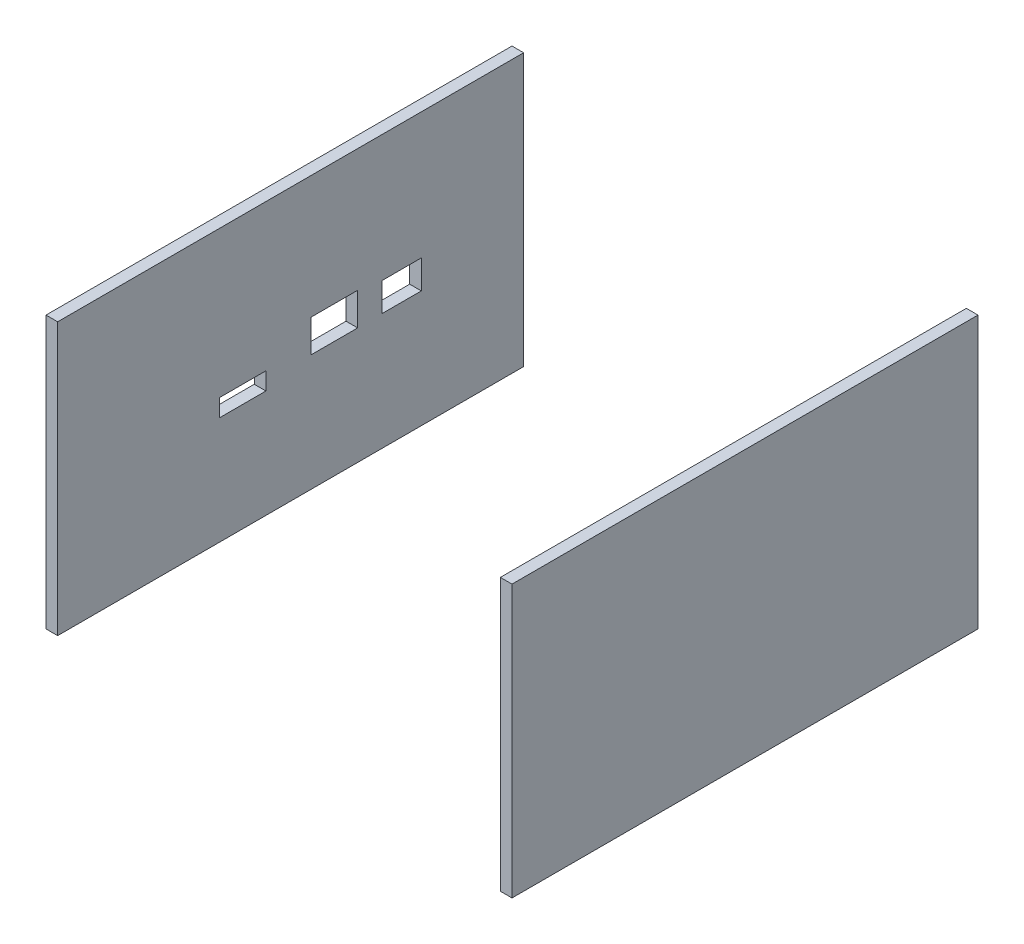
ISO-10303-21;
HEADER;
FILE_DESCRIPTION(('STEP AP214'),'2;1');
FILE_NAME('part.step','',(''),(''),'','','');
FILE_SCHEMA(('AUTOMOTIVE_DESIGN { 1 0 10303 214 1 1 1 1 }'));
ENDSEC;
DATA;
#1=APPLICATION_CONTEXT('core data for automotive mechanical design processes');
#2=APPLICATION_PROTOCOL_DEFINITION('international standard','automotive_design',2000,#1);
#3=PRODUCT_CONTEXT('',#1,'mechanical');
#4=PRODUCT('Part','Part','',(#3));
#5=PRODUCT_RELATED_PRODUCT_CATEGORY('part','',(#4));
#6=PRODUCT_DEFINITION_FORMATION('','',#4);
#7=PRODUCT_DEFINITION_CONTEXT('part definition',#1,'design');
#8=PRODUCT_DEFINITION('design','',#6,#7);
#9=PRODUCT_DEFINITION_SHAPE('','',#8);
#10=(LENGTH_UNIT() NAMED_UNIT(*) SI_UNIT(.MILLI.,.METRE.));
#11=(NAMED_UNIT(*) PLANE_ANGLE_UNIT() SI_UNIT($,.RADIAN.));
#12=(NAMED_UNIT(*) SI_UNIT($,.STERADIAN.) SOLID_ANGLE_UNIT());
#13=UNCERTAINTY_MEASURE_WITH_UNIT(LENGTH_MEASURE(1.E-05),#10,'distance_accuracy_value','');
#14=(GEOMETRIC_REPRESENTATION_CONTEXT(3) GLOBAL_UNCERTAINTY_ASSIGNED_CONTEXT((#13)) GLOBAL_UNIT_ASSIGNED_CONTEXT((#10,
#11,#12)) REPRESENTATION_CONTEXT('',''));
#15=CARTESIAN_POINT('',(0.,0.,0.));
#16=DIRECTION('',(0.,0.,1.));
#17=DIRECTION('',(1.,0.,0.));
#18=AXIS2_PLACEMENT_3D('',#15,#16,#17);
#19=CARTESIAN_POINT('',(60.,73.,60.));
#20=DIRECTION('',(0.,0.,-1.));
#21=DIRECTION('',(-1.,0.,0.));
#22=AXIS2_PLACEMENT_3D('',#19,#20,#21);
#23=PLANE('',#22);
#24=DIRECTION('',(1.,0.,0.));
#25=VECTOR('',#24,1.);
#26=CARTESIAN_POINT('',(60.,3.,60.));
#27=LINE('',#26,#25);
#28=CARTESIAN_POINT('',(-60.,3.,60.));
#29=VERTEX_POINT('',#28);
#30=CARTESIAN_POINT('',(-57.,3.,60.));
#31=VERTEX_POINT('',#30);
#32=EDGE_CURVE('E45',#29,#31,#27,.T.);
#33=ORIENTED_EDGE('',*,*,#32,.T.);
#34=DIRECTION('',(0.,1.,0.));
#35=VECTOR('',#34,1.);
#36=CARTESIAN_POINT('',(-57.,73.,60.));
#37=LINE('',#36,#35);
#38=CARTESIAN_POINT('',(-57.,73.,60.));
#39=VERTEX_POINT('',#38);
#40=EDGE_CURVE('E158',#31,#39,#37,.T.);
#41=ORIENTED_EDGE('',*,*,#40,.T.);
#42=DIRECTION('',(1.,0.,0.));
#43=VECTOR('',#42,1.);
#44=CARTESIAN_POINT('',(-60.,73.,60.));
#45=LINE('',#44,#43);
#46=CARTESIAN_POINT('',(-60.,73.,60.));
#47=VERTEX_POINT('',#46);
#48=EDGE_CURVE('E160',#47,#39,#45,.T.);
#49=ORIENTED_EDGE('',*,*,#48,.F.);
#50=DIRECTION('',(0.,-1.,0.));
#51=VECTOR('',#50,1.);
#52=CARTESIAN_POINT('',(-60.,73.,60.));
#53=LINE('',#52,#51);
#54=EDGE_CURVE('E173',#47,#29,#53,.T.);
#55=ORIENTED_EDGE('',*,*,#54,.T.);
#56=EDGE_LOOP('',(#33,#41,#49,#55));
#57=FACE_BOUND('',#56,.T.);
#58=ADVANCED_FACE('F42',(#57),#23,.F.);
#59=CARTESIAN_POINT('',(60.,73.,-60.));
#60=DIRECTION('',(0.,0.,1.));
#61=DIRECTION('',(1.,0.,0.));
#62=AXIS2_PLACEMENT_3D('',#59,#60,#61);
#63=PLANE('',#62);
#64=DIRECTION('',(1.,0.,0.));
#65=VECTOR('',#64,1.);
#66=CARTESIAN_POINT('',(60.,73.,-60.));
#67=LINE('',#66,#65);
#68=CARTESIAN_POINT('',(-60.,73.,-60.));
#69=VERTEX_POINT('',#68);
#70=CARTESIAN_POINT('',(-57.,73.,-60.));
#71=VERTEX_POINT('',#70);
#72=EDGE_CURVE('E167',#69,#71,#67,.T.);
#73=ORIENTED_EDGE('',*,*,#72,.T.);
#74=DIRECTION('',(0.,1.,0.));
#75=VECTOR('',#74,1.);
#76=CARTESIAN_POINT('',(-57.,3.,-60.));
#77=LINE('',#76,#75);
#78=CARTESIAN_POINT('',(-57.,3.,-60.));
#79=VERTEX_POINT('',#78);
#80=EDGE_CURVE('E12',#79,#71,#77,.T.);
#81=ORIENTED_EDGE('',*,*,#80,.F.);
#82=DIRECTION('',(-1.,0.,0.));
#83=VECTOR('',#82,1.);
#84=CARTESIAN_POINT('',(60.,3.,-60.));
#85=LINE('',#84,#83);
#86=CARTESIAN_POINT('',(-60.,3.,-60.));
#87=VERTEX_POINT('',#86);
#88=EDGE_CURVE('E161',#79,#87,#85,.T.);
#89=ORIENTED_EDGE('',*,*,#88,.T.);
#90=DIRECTION('',(0.,-1.,0.));
#91=VECTOR('',#90,1.);
#92=CARTESIAN_POINT('',(-60.,73.,-60.));
#93=LINE('',#92,#91);
#94=EDGE_CURVE('E223',#69,#87,#93,.T.);
#95=ORIENTED_EDGE('',*,*,#94,.F.);
#96=EDGE_LOOP('',(#73,#81,#89,#95));
#97=FACE_BOUND('',#96,.T.);
#98=ADVANCED_FACE('F164',(#97),#63,.F.);
#99=CARTESIAN_POINT('',(-55.452,3.,27.2274203577471));
#100=DIRECTION('',(0.,1.,0.));
#101=DIRECTION('',(0.,0.,1.));
#102=AXIS2_PLACEMENT_3D('',#99,#100,#101);
#103=PLANE('',#102);
#104=ORIENTED_EDGE('',*,*,#88,.F.);
#105=DIRECTION('',(0.,0.,1.));
#106=VECTOR('',#105,1.);
#107=CARTESIAN_POINT('',(-57.,3.,-60.));
#108=LINE('',#107,#106);
#109=EDGE_CURVE('E60',#79,#31,#108,.T.);
#110=ORIENTED_EDGE('',*,*,#109,.T.);
#111=ORIENTED_EDGE('',*,*,#32,.F.);
#112=DIRECTION('',(0.,0.,1.));
#113=VECTOR('',#112,1.);
#114=CARTESIAN_POINT('',(-60.,3.,60.));
#115=LINE('',#114,#113);
#116=EDGE_CURVE('E170',#87,#29,#115,.T.);
#117=ORIENTED_EDGE('',*,*,#116,.F.);
#118=EDGE_LOOP('',(#104,#110,#111,#117));
#119=FACE_BOUND('',#118,.T.);
#120=ADVANCED_FACE('F168',(#119),#103,.F.);
#121=CARTESIAN_POINT('',(-60.,73.,-80.));
#122=DIRECTION('',(0.,-1.,0.));
#123=DIRECTION('',(0.,0.,-1.));
#124=AXIS2_PLACEMENT_3D('',#121,#122,#123);
#125=PLANE('',#124);
#126=ORIENTED_EDGE('',*,*,#48,.T.);
#127=DIRECTION('',(0.,0.,-1.));
#128=VECTOR('',#127,1.);
#129=CARTESIAN_POINT('',(-57.,73.,-80.));
#130=LINE('',#129,#128);
#131=EDGE_CURVE('E151',#39,#71,#130,.T.);
#132=ORIENTED_EDGE('',*,*,#131,.T.);
#133=ORIENTED_EDGE('',*,*,#72,.F.);
#134=DIRECTION('',(0.,0.,1.));
#135=VECTOR('',#134,1.);
#136=CARTESIAN_POINT('',(-60.,73.,-80.));
#137=LINE('',#136,#135);
#138=EDGE_CURVE('E253',#69,#47,#137,.T.);
#139=ORIENTED_EDGE('',*,*,#138,.T.);
#140=EDGE_LOOP('',(#126,#132,#133,#139));
#141=FACE_BOUND('',#140,.T.);
#142=ADVANCED_FACE('F277',(#141),#125,.F.);
#143=CARTESIAN_POINT('',(-60.,73.,60.));
#144=DIRECTION('',(1.,0.,0.));
#145=DIRECTION('',(0.,0.,-1.));
#146=AXIS2_PLACEMENT_3D('',#143,#144,#145);
#147=PLANE('',#146);
#148=DIRECTION('',(0.,1.,0.));
#149=VECTOR('',#148,1.);
#150=CARTESIAN_POINT('',(-60.,0.,18.3674203577471));
#151=LINE('',#150,#149);
#152=CARTESIAN_POINT('',(-60.,30.75,18.3674203577471));
#153=VERTEX_POINT('',#152);
#154=CARTESIAN_POINT('',(-60.,35.25,18.3674203577471));
#155=VERTEX_POINT('',#154);
#156=EDGE_CURVE('E51',#153,#155,#151,.T.);
#157=ORIENTED_EDGE('',*,*,#156,.F.);
#158=DIRECTION('',(0.,0.,1.));
#159=VECTOR('',#158,1.);
#160=CARTESIAN_POINT('',(-60.,30.75,0.));
#161=LINE('',#160,#159);
#162=CARTESIAN_POINT('',(-60.,30.75,6.36742035774705));
#163=VERTEX_POINT('',#162);
#164=EDGE_CURVE('E247',#163,#153,#161,.T.);
#165=ORIENTED_EDGE('',*,*,#164,.F.);
#166=DIRECTION('',(0.,1.,0.));
#167=VECTOR('',#166,1.);
#168=CARTESIAN_POINT('',(-60.,0.,6.36742035774705));
#169=LINE('',#168,#167);
#170=CARTESIAN_POINT('',(-60.,35.25,6.36742035774705));
#171=VERTEX_POINT('',#170);
#172=EDGE_CURVE('E249',#163,#171,#169,.T.);
#173=ORIENTED_EDGE('',*,*,#172,.T.);
#174=DIRECTION('',(0.,0.,1.));
#175=VECTOR('',#174,1.);
#176=CARTESIAN_POINT('',(-60.,35.25,0.));
#177=LINE('',#176,#175);
#178=EDGE_CURVE('E252',#171,#155,#177,.T.);
#179=ORIENTED_EDGE('',*,*,#178,.T.);
#180=EDGE_LOOP('',(#157,#165,#173,#179));
#181=FACE_BOUND('',#180,.T.);
#182=DIRECTION('',(0.,-1.,0.));
#183=VECTOR('',#182,1.);
#184=CARTESIAN_POINT('',(-60.,0.,-23.5647531211439));
#185=LINE('',#184,#183);
#186=CARTESIAN_POINT('',(-60.,40.4239596536926,-23.5647531211439));
#187=VERTEX_POINT('',#186);
#188=CARTESIAN_POINT('',(-60.,33.0619311208175,-23.5647531211439));
#189=VERTEX_POINT('',#188);
#190=EDGE_CURVE('E256',#187,#189,#185,.T.);
#191=ORIENTED_EDGE('',*,*,#190,.T.);
#192=DIRECTION('',(0.,0.,1.));
#193=VECTOR('',#192,1.);
#194=CARTESIAN_POINT('',(-60.,33.0619311208175,0.));
#195=LINE('',#194,#193);
#196=CARTESIAN_POINT('',(-60.,33.0619311208175,-33.6488101868942));
#197=VERTEX_POINT('',#196);
#198=EDGE_CURVE('E200',#197,#189,#195,.T.);
#199=ORIENTED_EDGE('',*,*,#198,.F.);
#200=DIRECTION('',(0.,-1.,0.));
#201=VECTOR('',#200,1.);
#202=CARTESIAN_POINT('',(-60.,0.,-33.6488101868942));
#203=LINE('',#202,#201);
#204=CARTESIAN_POINT('',(-60.,40.4239596536926,-33.6488101868942));
#205=VERTEX_POINT('',#204);
#206=EDGE_CURVE('E264',#205,#197,#203,.T.);
#207=ORIENTED_EDGE('',*,*,#206,.F.);
#208=DIRECTION('',(0.,0.,1.));
#209=VECTOR('',#208,1.);
#210=CARTESIAN_POINT('',(-60.,40.4239596536926,0.));
#211=LINE('',#210,#209);
#212=EDGE_CURVE('E225',#205,#187,#211,.T.);
#213=ORIENTED_EDGE('',*,*,#212,.T.);
#214=EDGE_LOOP('',(#191,#199,#207,#213));
#215=FACE_BOUND('',#214,.T.);
#216=ORIENTED_EDGE('',*,*,#54,.F.);
#217=ORIENTED_EDGE('',*,*,#138,.F.);
#218=ORIENTED_EDGE('',*,*,#94,.T.);
#219=ORIENTED_EDGE('',*,*,#116,.T.);
#220=EDGE_LOOP('',(#216,#217,#218,#219));
#221=FACE_BOUND('',#220,.T.);
#222=DIRECTION('',(0.,1.,0.));
#223=VECTOR('',#222,1.);
#224=CARTESIAN_POINT('',(-60.,0.,-17.2594149314277));
#225=LINE('',#224,#223);
#226=CARTESIAN_POINT('',(-60.,33.,-17.2594149314277));
#227=VERTEX_POINT('',#226);
#228=CARTESIAN_POINT('',(-60.,41.4,-17.2594149314277));
#229=VERTEX_POINT('',#228);
#230=EDGE_CURVE('E227',#227,#229,#225,.T.);
#231=ORIENTED_EDGE('',*,*,#230,.T.);
#232=DIRECTION('',(0.,0.,-1.));
#233=VECTOR('',#232,1.);
#234=CARTESIAN_POINT('',(-60.,41.4,0.));
#235=LINE('',#234,#233);
#236=CARTESIAN_POINT('',(-60.,41.4,-5.25941493142768));
#237=VERTEX_POINT('',#236);
#238=EDGE_CURVE('E218',#237,#229,#235,.T.);
#239=ORIENTED_EDGE('',*,*,#238,.F.);
#240=DIRECTION('',(0.,1.,0.));
#241=VECTOR('',#240,1.);
#242=CARTESIAN_POINT('',(-60.,0.,-5.25941493142768));
#243=LINE('',#242,#241);
#244=CARTESIAN_POINT('',(-60.,33.,-5.25941493142768));
#245=VERTEX_POINT('',#244);
#246=EDGE_CURVE('E230',#245,#237,#243,.T.);
#247=ORIENTED_EDGE('',*,*,#246,.F.);
#248=DIRECTION('',(0.,0.,-1.));
#249=VECTOR('',#248,1.);
#250=CARTESIAN_POINT('',(-60.,33.,0.));
#251=LINE('',#250,#249);
#252=EDGE_CURVE('E188',#245,#227,#251,.T.);
#253=ORIENTED_EDGE('',*,*,#252,.T.);
#254=EDGE_LOOP('',(#231,#239,#247,#253));
#255=FACE_BOUND('',#254,.T.);
#256=ADVANCED_FACE('F281',(#181,#215,#221,#255),#147,.F.);
#257=CARTESIAN_POINT('',(-57.,73.,57.));
#258=DIRECTION('',(1.,0.,0.));
#259=DIRECTION('',(0.,0.,-1.));
#260=AXIS2_PLACEMENT_3D('',#257,#258,#259);
#261=PLANE('',#260);
#262=DIRECTION('',(0.,0.,-1.));
#263=VECTOR('',#262,1.);
#264=CARTESIAN_POINT('',(-57.,30.75,57.));
#265=LINE('',#264,#263);
#266=CARTESIAN_POINT('',(-57.,30.75,18.3674203577471));
#267=VERTEX_POINT('',#266);
#268=CARTESIAN_POINT('',(-57.,30.75,6.36742035774705));
#269=VERTEX_POINT('',#268);
#270=EDGE_CURVE('E177',#267,#269,#265,.T.);
#271=ORIENTED_EDGE('',*,*,#270,.F.);
#272=DIRECTION('',(0.,-1.,0.));
#273=VECTOR('',#272,1.);
#274=CARTESIAN_POINT('',(-57.,73.,18.3674203577471));
#275=LINE('',#274,#273);
#276=CARTESIAN_POINT('',(-57.,35.25,18.3674203577471));
#277=VERTEX_POINT('',#276);
#278=EDGE_CURVE('E189',#277,#267,#275,.T.);
#279=ORIENTED_EDGE('',*,*,#278,.F.);
#280=DIRECTION('',(0.,0.,-1.));
#281=VECTOR('',#280,1.);
#282=CARTESIAN_POINT('',(-57.,35.25,57.));
#283=LINE('',#282,#281);
#284=CARTESIAN_POINT('',(-57.,35.25,6.36742035774705));
#285=VERTEX_POINT('',#284);
#286=EDGE_CURVE('E185',#277,#285,#283,.T.);
#287=ORIENTED_EDGE('',*,*,#286,.T.);
#288=DIRECTION('',(0.,-1.,0.));
#289=VECTOR('',#288,1.);
#290=CARTESIAN_POINT('',(-57.,73.,6.36742035774705));
#291=LINE('',#290,#289);
#292=EDGE_CURVE('E181',#285,#269,#291,.T.);
#293=ORIENTED_EDGE('',*,*,#292,.T.);
#294=EDGE_LOOP('',(#271,#279,#287,#293));
#295=FACE_BOUND('',#294,.T.);
#296=DIRECTION('',(0.,0.,-1.));
#297=VECTOR('',#296,1.);
#298=CARTESIAN_POINT('',(-57.,33.0619311208175,57.));
#299=LINE('',#298,#297);
#300=CARTESIAN_POINT('',(-57.,33.0619311208175,-23.5647531211439));
#301=VERTEX_POINT('',#300);
#302=CARTESIAN_POINT('',(-57.,33.0619311208175,-33.6488101868942));
#303=VERTEX_POINT('',#302);
#304=EDGE_CURVE('E193',#301,#303,#299,.T.);
#305=ORIENTED_EDGE('',*,*,#304,.F.);
#306=DIRECTION('',(0.,1.,0.));
#307=VECTOR('',#306,1.);
#308=CARTESIAN_POINT('',(-57.,73.,-23.5647531211439));
#309=LINE('',#308,#307);
#310=CARTESIAN_POINT('',(-57.,40.4239596536926,-23.5647531211439));
#311=VERTEX_POINT('',#310);
#312=EDGE_CURVE('E184',#301,#311,#309,.T.);
#313=ORIENTED_EDGE('',*,*,#312,.T.);
#314=DIRECTION('',(0.,0.,-1.));
#315=VECTOR('',#314,1.);
#316=CARTESIAN_POINT('',(-57.,40.4239596536926,57.));
#317=LINE('',#316,#315);
#318=CARTESIAN_POINT('',(-57.,40.4239596536926,-33.6488101868942));
#319=VERTEX_POINT('',#318);
#320=EDGE_CURVE('E201',#311,#319,#317,.T.);
#321=ORIENTED_EDGE('',*,*,#320,.T.);
#322=DIRECTION('',(0.,1.,0.));
#323=VECTOR('',#322,1.);
#324=CARTESIAN_POINT('',(-57.,73.,-33.6488101868942));
#325=LINE('',#324,#323);
#326=EDGE_CURVE('E197',#303,#319,#325,.T.);
#327=ORIENTED_EDGE('',*,*,#326,.F.);
#328=EDGE_LOOP('',(#305,#313,#321,#327));
#329=FACE_BOUND('',#328,.T.);
#330=ORIENTED_EDGE('',*,*,#40,.F.);
#331=ORIENTED_EDGE('',*,*,#109,.F.);
#332=ORIENTED_EDGE('',*,*,#80,.T.);
#333=ORIENTED_EDGE('',*,*,#131,.F.);
#334=EDGE_LOOP('',(#330,#331,#332,#333));
#335=FACE_BOUND('',#334,.T.);
#336=DIRECTION('',(0.,0.,1.));
#337=VECTOR('',#336,1.);
#338=CARTESIAN_POINT('',(-57.,41.4,57.));
#339=LINE('',#338,#337);
#340=CARTESIAN_POINT('',(-57.,41.4,-17.2594149314277));
#341=VERTEX_POINT('',#340);
#342=CARTESIAN_POINT('',(-57.,41.4,-5.25941493142768));
#343=VERTEX_POINT('',#342);
#344=EDGE_CURVE('E210',#341,#343,#339,.T.);
#345=ORIENTED_EDGE('',*,*,#344,.F.);
#346=DIRECTION('',(0.,-1.,0.));
#347=VECTOR('',#346,1.);
#348=CARTESIAN_POINT('',(-57.,73.,-17.2594149314277));
#349=LINE('',#348,#347);
#350=CARTESIAN_POINT('',(-57.,33.,-17.2594149314277));
#351=VERTEX_POINT('',#350);
#352=EDGE_CURVE('E204',#341,#351,#349,.T.);
#353=ORIENTED_EDGE('',*,*,#352,.T.);
#354=DIRECTION('',(0.,0.,1.));
#355=VECTOR('',#354,1.);
#356=CARTESIAN_POINT('',(-57.,33.,57.));
#357=LINE('',#356,#355);
#358=CARTESIAN_POINT('',(-57.,33.,-5.25941493142768));
#359=VERTEX_POINT('',#358);
#360=EDGE_CURVE('E209',#351,#359,#357,.T.);
#361=ORIENTED_EDGE('',*,*,#360,.T.);
#362=DIRECTION('',(0.,-1.,0.));
#363=VECTOR('',#362,1.);
#364=CARTESIAN_POINT('',(-57.,73.,-5.25941493142768));
#365=LINE('',#364,#363);
#366=EDGE_CURVE('E214',#343,#359,#365,.T.);
#367=ORIENTED_EDGE('',*,*,#366,.F.);
#368=EDGE_LOOP('',(#345,#353,#361,#367));
#369=FACE_BOUND('',#368,.T.);
#370=ADVANCED_FACE('F154',(#295,#329,#335,#369),#261,.T.);
#371=CARTESIAN_POINT('',(-55.,0.,-17.2594149314277));
#372=DIRECTION('',(0.,0.,1.));
#373=DIRECTION('',(1.,0.,0.));
#374=AXIS2_PLACEMENT_3D('',#371,#372,#373);
#375=PLANE('',#374);
#376=DIRECTION('',(-1.,0.,0.));
#377=VECTOR('',#376,1.);
#378=CARTESIAN_POINT('',(-55.,41.4,-17.2594149314277));
#379=LINE('',#378,#377);
#380=EDGE_CURVE('E213',#341,#229,#379,.T.);
#381=ORIENTED_EDGE('',*,*,#380,.T.);
#382=ORIENTED_EDGE('',*,*,#230,.F.);
#383=DIRECTION('',(-1.,0.,0.));
#384=VECTOR('',#383,1.);
#385=CARTESIAN_POINT('',(-55.,33.,-17.2594149314277));
#386=LINE('',#385,#384);
#387=EDGE_CURVE('E196',#351,#227,#386,.T.);
#388=ORIENTED_EDGE('',*,*,#387,.F.);
#389=ORIENTED_EDGE('',*,*,#352,.F.);
#390=EDGE_LOOP('',(#381,#382,#388,#389));
#391=FACE_BOUND('',#390,.T.);
#392=ADVANCED_FACE('F291',(#391),#375,.T.);
#393=CARTESIAN_POINT('',(-55.,41.4,0.));
#394=DIRECTION('',(0.,1.,0.));
#395=DIRECTION('',(0.,0.,1.));
#396=AXIS2_PLACEMENT_3D('',#393,#394,#395);
#397=PLANE('',#396);
#398=ORIENTED_EDGE('',*,*,#344,.T.);
#399=DIRECTION('',(-1.,0.,0.));
#400=VECTOR('',#399,1.);
#401=CARTESIAN_POINT('',(-55.,41.4,-5.25941493142768));
#402=LINE('',#401,#400);
#403=EDGE_CURVE('E212',#343,#237,#402,.T.);
#404=ORIENTED_EDGE('',*,*,#403,.T.);
#405=ORIENTED_EDGE('',*,*,#238,.T.);
#406=ORIENTED_EDGE('',*,*,#380,.F.);
#407=EDGE_LOOP('',(#398,#404,#405,#406));
#408=FACE_BOUND('',#407,.T.);
#409=ADVANCED_FACE('F298',(#408),#397,.F.);
#410=CARTESIAN_POINT('',(-55.,0.,-5.25941493142768));
#411=DIRECTION('',(0.,0.,1.));
#412=DIRECTION('',(1.,0.,0.));
#413=AXIS2_PLACEMENT_3D('',#410,#411,#412);
#414=PLANE('',#413);
#415=ORIENTED_EDGE('',*,*,#366,.T.);
#416=DIRECTION('',(-1.,0.,0.));
#417=VECTOR('',#416,1.);
#418=CARTESIAN_POINT('',(-55.,33.,-5.25941493142768));
#419=LINE('',#418,#417);
#420=EDGE_CURVE('E217',#359,#245,#419,.T.);
#421=ORIENTED_EDGE('',*,*,#420,.T.);
#422=ORIENTED_EDGE('',*,*,#246,.T.);
#423=ORIENTED_EDGE('',*,*,#403,.F.);
#424=EDGE_LOOP('',(#415,#421,#422,#423));
#425=FACE_BOUND('',#424,.T.);
#426=ADVANCED_FACE('F301',(#425),#414,.F.);
#427=CARTESIAN_POINT('',(-55.,33.,0.));
#428=DIRECTION('',(0.,1.,0.));
#429=DIRECTION('',(0.,0.,1.));
#430=AXIS2_PLACEMENT_3D('',#427,#428,#429);
#431=PLANE('',#430);
#432=ORIENTED_EDGE('',*,*,#387,.T.);
#433=ORIENTED_EDGE('',*,*,#252,.F.);
#434=ORIENTED_EDGE('',*,*,#420,.F.);
#435=ORIENTED_EDGE('',*,*,#360,.F.);
#436=EDGE_LOOP('',(#432,#433,#434,#435));
#437=FACE_BOUND('',#436,.T.);
#438=ADVANCED_FACE('F294',(#437),#431,.T.);
#439=CARTESIAN_POINT('',(-55.,33.0619311208175,0.));
#440=DIRECTION('',(0.,-1.,0.));
#441=DIRECTION('',(0.,0.,-1.));
#442=AXIS2_PLACEMENT_3D('',#439,#440,#441);
#443=PLANE('',#442);
#444=ORIENTED_EDGE('',*,*,#304,.T.);
#445=DIRECTION('',(-1.,0.,0.));
#446=VECTOR('',#445,1.);
#447=CARTESIAN_POINT('',(-55.,33.0619311208175,-33.6488101868942));
#448=LINE('',#447,#446);
#449=EDGE_CURVE('E195',#303,#197,#448,.T.);
#450=ORIENTED_EDGE('',*,*,#449,.T.);
#451=ORIENTED_EDGE('',*,*,#198,.T.);
#452=DIRECTION('',(-1.,0.,0.));
#453=VECTOR('',#452,1.);
#454=CARTESIAN_POINT('',(-55.,33.0619311208175,-23.5647531211439));
#455=LINE('',#454,#453);
#456=EDGE_CURVE('E180',#301,#189,#455,.T.);
#457=ORIENTED_EDGE('',*,*,#456,.F.);
#458=EDGE_LOOP('',(#444,#450,#451,#457));
#459=FACE_BOUND('',#458,.T.);
#460=ADVANCED_FACE('F308',(#459),#443,.F.);
#461=CARTESIAN_POINT('',(-55.,0.,-33.6488101868942));
#462=DIRECTION('',(0.,0.,-1.));
#463=DIRECTION('',(-1.,0.,0.));
#464=AXIS2_PLACEMENT_3D('',#461,#462,#463);
#465=PLANE('',#464);
#466=ORIENTED_EDGE('',*,*,#326,.T.);
#467=DIRECTION('',(-1.,0.,0.));
#468=VECTOR('',#467,1.);
#469=CARTESIAN_POINT('',(-55.,40.4239596536926,-33.6488101868942));
#470=LINE('',#469,#468);
#471=EDGE_CURVE('E199',#319,#205,#470,.T.);
#472=ORIENTED_EDGE('',*,*,#471,.T.);
#473=ORIENTED_EDGE('',*,*,#206,.T.);
#474=ORIENTED_EDGE('',*,*,#449,.F.);
#475=EDGE_LOOP('',(#466,#472,#473,#474));
#476=FACE_BOUND('',#475,.T.);
#477=ADVANCED_FACE('F355',(#476),#465,.F.);
#478=CARTESIAN_POINT('',(-55.,40.4239596536926,0.));
#479=DIRECTION('',(0.,-1.,0.));
#480=DIRECTION('',(0.,0.,-1.));
#481=AXIS2_PLACEMENT_3D('',#478,#479,#480);
#482=PLANE('',#481);
#483=DIRECTION('',(-1.,0.,0.));
#484=VECTOR('',#483,1.);
#485=CARTESIAN_POINT('',(-55.,40.4239596536926,-23.5647531211439));
#486=LINE('',#485,#484);
#487=EDGE_CURVE('E262',#311,#187,#486,.T.);
#488=ORIENTED_EDGE('',*,*,#487,.T.);
#489=ORIENTED_EDGE('',*,*,#212,.F.);
#490=ORIENTED_EDGE('',*,*,#471,.F.);
#491=ORIENTED_EDGE('',*,*,#320,.F.);
#492=EDGE_LOOP('',(#488,#489,#490,#491));
#493=FACE_BOUND('',#492,.T.);
#494=ADVANCED_FACE('F365',(#493),#482,.T.);
#495=CARTESIAN_POINT('',(-55.,0.,-23.5647531211439));
#496=DIRECTION('',(0.,0.,-1.));
#497=DIRECTION('',(-1.,0.,0.));
#498=AXIS2_PLACEMENT_3D('',#495,#496,#497);
#499=PLANE('',#498);
#500=ORIENTED_EDGE('',*,*,#456,.T.);
#501=ORIENTED_EDGE('',*,*,#190,.F.);
#502=ORIENTED_EDGE('',*,*,#487,.F.);
#503=ORIENTED_EDGE('',*,*,#312,.F.);
#504=EDGE_LOOP('',(#500,#501,#502,#503));
#505=FACE_BOUND('',#504,.T.);
#506=ADVANCED_FACE('F375',(#505),#499,.T.);
#507=CARTESIAN_POINT('',(-55.,30.75,0.));
#508=DIRECTION('',(0.,-1.,0.));
#509=DIRECTION('',(0.,0.,-1.));
#510=AXIS2_PLACEMENT_3D('',#507,#508,#509);
#511=PLANE('',#510);
#512=ORIENTED_EDGE('',*,*,#270,.T.);
#513=DIRECTION('',(-1.,0.,0.));
#514=VECTOR('',#513,1.);
#515=CARTESIAN_POINT('',(-55.,30.75,6.36742035774705));
#516=LINE('',#515,#514);
#517=EDGE_CURVE('E179',#269,#163,#516,.T.);
#518=ORIENTED_EDGE('',*,*,#517,.T.);
#519=ORIENTED_EDGE('',*,*,#164,.T.);
#520=DIRECTION('',(-1.,0.,0.));
#521=VECTOR('',#520,1.);
#522=CARTESIAN_POINT('',(-55.,30.75,18.3674203577471));
#523=LINE('',#522,#521);
#524=EDGE_CURVE('E191',#267,#153,#523,.T.);
#525=ORIENTED_EDGE('',*,*,#524,.F.);
#526=EDGE_LOOP('',(#512,#518,#519,#525));
#527=FACE_BOUND('',#526,.T.);
#528=ADVANCED_FACE('F385',(#527),#511,.F.);
#529=CARTESIAN_POINT('',(-55.,0.,6.36742035774705));
#530=DIRECTION('',(0.,0.,1.));
#531=DIRECTION('',(1.,0.,0.));
#532=AXIS2_PLACEMENT_3D('',#529,#530,#531);
#533=PLANE('',#532);
#534=DIRECTION('',(-1.,0.,0.));
#535=VECTOR('',#534,1.);
#536=CARTESIAN_POINT('',(-55.,35.25,6.36742035774705));
#537=LINE('',#536,#535);
#538=EDGE_CURVE('E245',#285,#171,#537,.T.);
#539=ORIENTED_EDGE('',*,*,#538,.T.);
#540=ORIENTED_EDGE('',*,*,#172,.F.);
#541=ORIENTED_EDGE('',*,*,#517,.F.);
#542=ORIENTED_EDGE('',*,*,#292,.F.);
#543=EDGE_LOOP('',(#539,#540,#541,#542));
#544=FACE_BOUND('',#543,.T.);
#545=ADVANCED_FACE('F395',(#544),#533,.T.);
#546=CARTESIAN_POINT('',(-55.,35.25,0.));
#547=DIRECTION('',(0.,-1.,0.));
#548=DIRECTION('',(0.,0.,-1.));
#549=AXIS2_PLACEMENT_3D('',#546,#547,#548);
#550=PLANE('',#549);
#551=DIRECTION('',(-1.,0.,0.));
#552=VECTOR('',#551,1.);
#553=CARTESIAN_POINT('',(-55.,35.25,18.3674203577471));
#554=LINE('',#553,#552);
#555=EDGE_CURVE('E192',#277,#155,#554,.T.);
#556=ORIENTED_EDGE('',*,*,#555,.T.);
#557=ORIENTED_EDGE('',*,*,#178,.F.);
#558=ORIENTED_EDGE('',*,*,#538,.F.);
#559=ORIENTED_EDGE('',*,*,#286,.F.);
#560=EDGE_LOOP('',(#556,#557,#558,#559));
#561=FACE_BOUND('',#560,.T.);
#562=ADVANCED_FACE('F405',(#561),#550,.T.);
#563=CARTESIAN_POINT('',(-55.,0.,18.3674203577471));
#564=DIRECTION('',(0.,0.,1.));
#565=DIRECTION('',(1.,0.,0.));
#566=AXIS2_PLACEMENT_3D('',#563,#564,#565);
#567=PLANE('',#566);
#568=ORIENTED_EDGE('',*,*,#278,.T.);
#569=ORIENTED_EDGE('',*,*,#524,.T.);
#570=ORIENTED_EDGE('',*,*,#156,.T.);
#571=ORIENTED_EDGE('',*,*,#555,.F.);
#572=EDGE_LOOP('',(#568,#569,#570,#571));
#573=FACE_BOUND('',#572,.T.);
#574=ADVANCED_FACE('F415',(#573),#567,.F.);
#575=CLOSED_SHELL('',(#58,#98,#120,#142,#256,#370,#392,#409,#426,#438,#460,#477,#494,#506,#528,
#545,#562,#574));
#576=MANIFOLD_SOLID_BREP('B2',#575);
#577=CARTESIAN_POINT('',(60.,73.,60.));
#578=DIRECTION('',(-1.,0.,0.));
#579=DIRECTION('',(0.,0.,1.));
#580=AXIS2_PLACEMENT_3D('',#577,#578,#579);
#581=PLANE('',#580);
#582=DIRECTION('',(0.,-1.,0.));
#583=VECTOR('',#582,1.);
#584=CARTESIAN_POINT('',(60.,73.,-60.));
#585=LINE('',#584,#583);
#586=CARTESIAN_POINT('',(60.,73.,-60.));
#587=VERTEX_POINT('',#586);
#588=CARTESIAN_POINT('',(60.,3.,-60.));
#589=VERTEX_POINT('',#588);
#590=EDGE_CURVE('E562',#587,#589,#585,.T.);
#591=ORIENTED_EDGE('',*,*,#590,.F.);
#592=DIRECTION('',(0.,0.,1.));
#593=VECTOR('',#592,1.);
#594=CARTESIAN_POINT('',(60.,73.,-80.));
#595=LINE('',#594,#593);
#596=CARTESIAN_POINT('',(60.,73.,60.));
#597=VERTEX_POINT('',#596);
#598=EDGE_CURVE('E547',#587,#597,#595,.T.);
#599=ORIENTED_EDGE('',*,*,#598,.T.);
#600=DIRECTION('',(0.,-1.,0.));
#601=VECTOR('',#600,1.);
#602=CARTESIAN_POINT('',(60.,73.,60.));
#603=LINE('',#602,#601);
#604=CARTESIAN_POINT('',(60.,3.,60.));
#605=VERTEX_POINT('',#604);
#606=EDGE_CURVE('E543',#597,#605,#603,.T.);
#607=ORIENTED_EDGE('',*,*,#606,.T.);
#608=DIRECTION('',(0.,0.,-1.));
#609=VECTOR('',#608,1.);
#610=CARTESIAN_POINT('',(60.,3.,60.));
#611=LINE('',#610,#609);
#612=EDGE_CURVE('E549',#605,#589,#611,.T.);
#613=ORIENTED_EDGE('',*,*,#612,.T.);
#614=EDGE_LOOP('',(#591,#599,#607,#613));
#615=FACE_BOUND('',#614,.T.);
#616=ADVANCED_FACE('F501',(#615),#581,.F.);
#617=CARTESIAN_POINT('',(-60.,73.,-80.));
#618=DIRECTION('',(0.,-1.,0.));
#619=DIRECTION('',(0.,0.,-1.));
#620=AXIS2_PLACEMENT_3D('',#617,#618,#619);
#621=PLANE('',#620);
#622=DIRECTION('',(1.,0.,0.));
#623=VECTOR('',#622,1.);
#624=CARTESIAN_POINT('',(60.,73.,-60.));
#625=LINE('',#624,#623);
#626=CARTESIAN_POINT('',(57.,73.,-60.));
#627=VERTEX_POINT('',#626);
#628=EDGE_CURVE('E524',#627,#587,#625,.T.);
#629=ORIENTED_EDGE('',*,*,#628,.F.);
#630=DIRECTION('',(0.,0.,-1.));
#631=VECTOR('',#630,1.);
#632=CARTESIAN_POINT('',(57.,73.,57.));
#633=LINE('',#632,#631);
#634=CARTESIAN_POINT('',(57.,73.,60.));
#635=VERTEX_POINT('',#634);
#636=EDGE_CURVE('E516',#635,#627,#633,.T.);
#637=ORIENTED_EDGE('',*,*,#636,.F.);
#638=DIRECTION('',(1.,0.,0.));
#639=VECTOR('',#638,1.);
#640=CARTESIAN_POINT('',(-60.,73.,60.));
#641=LINE('',#640,#639);
#642=EDGE_CURVE('E40',#635,#597,#641,.T.);
#643=ORIENTED_EDGE('',*,*,#642,.T.);
#644=ORIENTED_EDGE('',*,*,#598,.F.);
#645=EDGE_LOOP('',(#629,#637,#643,#644));
#646=FACE_BOUND('',#645,.T.);
#647=ADVANCED_FACE('F503',(#646),#621,.F.);
#648=CARTESIAN_POINT('',(-55.452,3.,27.2274203577471));
#649=DIRECTION('',(0.,1.,0.));
#650=DIRECTION('',(0.,0.,1.));
#651=AXIS2_PLACEMENT_3D('',#648,#649,#650);
#652=PLANE('',#651);
#653=DIRECTION('',(1.,0.,0.));
#654=VECTOR('',#653,1.);
#655=CARTESIAN_POINT('',(60.,3.,60.));
#656=LINE('',#655,#654);
#657=CARTESIAN_POINT('',(57.,3.,60.));
#658=VERTEX_POINT('',#657);
#659=EDGE_CURVE('E505',#658,#605,#656,.T.);
#660=ORIENTED_EDGE('',*,*,#659,.F.);
#661=DIRECTION('',(0.,0.,-1.));
#662=VECTOR('',#661,1.);
#663=CARTESIAN_POINT('',(57.,3.,57.));
#664=LINE('',#663,#662);
#665=CARTESIAN_POINT('',(57.,3.,-60.));
#666=VERTEX_POINT('',#665);
#667=EDGE_CURVE('E510',#658,#666,#664,.T.);
#668=ORIENTED_EDGE('',*,*,#667,.T.);
#669=DIRECTION('',(-1.,0.,0.));
#670=VECTOR('',#669,1.);
#671=CARTESIAN_POINT('',(60.,3.,-60.));
#672=LINE('',#671,#670);
#673=EDGE_CURVE('E552',#589,#666,#672,.T.);
#674=ORIENTED_EDGE('',*,*,#673,.F.);
#675=ORIENTED_EDGE('',*,*,#612,.F.);
#676=EDGE_LOOP('',(#660,#668,#674,#675));
#677=FACE_BOUND('',#676,.T.);
#678=ADVANCED_FACE('F550',(#677),#652,.F.);
#679=CARTESIAN_POINT('',(57.,73.,57.));
#680=DIRECTION('',(-1.,0.,0.));
#681=DIRECTION('',(0.,0.,1.));
#682=AXIS2_PLACEMENT_3D('',#679,#680,#681);
#683=PLANE('',#682);
#684=ORIENTED_EDGE('',*,*,#667,.F.);
#685=DIRECTION('',(0.,-1.,0.));
#686=VECTOR('',#685,1.);
#687=CARTESIAN_POINT('',(57.,73.,60.));
#688=LINE('',#687,#686);
#689=EDGE_CURVE('E544',#635,#658,#688,.T.);
#690=ORIENTED_EDGE('',*,*,#689,.F.);
#691=ORIENTED_EDGE('',*,*,#636,.T.);
#692=DIRECTION('',(0.,1.,0.));
#693=VECTOR('',#692,1.);
#694=CARTESIAN_POINT('',(57.,3.,-60.));
#695=LINE('',#694,#693);
#696=EDGE_CURVE('E573',#666,#627,#695,.T.);
#697=ORIENTED_EDGE('',*,*,#696,.F.);
#698=EDGE_LOOP('',(#684,#690,#691,#697));
#699=FACE_BOUND('',#698,.T.);
#700=ADVANCED_FACE('F571',(#699),#683,.T.);
#701=CARTESIAN_POINT('',(60.,73.,-60.));
#702=DIRECTION('',(0.,0.,1.));
#703=DIRECTION('',(1.,0.,0.));
#704=AXIS2_PLACEMENT_3D('',#701,#702,#703);
#705=PLANE('',#704);
#706=ORIENTED_EDGE('',*,*,#673,.T.);
#707=ORIENTED_EDGE('',*,*,#696,.T.);
#708=ORIENTED_EDGE('',*,*,#628,.T.);
#709=ORIENTED_EDGE('',*,*,#590,.T.);
#710=EDGE_LOOP('',(#706,#707,#708,#709));
#711=FACE_BOUND('',#710,.T.);
#712=ADVANCED_FACE('F574',(#711),#705,.F.);
#713=CARTESIAN_POINT('',(60.,73.,60.));
#714=DIRECTION('',(0.,0.,-1.));
#715=DIRECTION('',(-1.,0.,0.));
#716=AXIS2_PLACEMENT_3D('',#713,#714,#715);
#717=PLANE('',#716);
#718=ORIENTED_EDGE('',*,*,#642,.F.);
#719=ORIENTED_EDGE('',*,*,#689,.T.);
#720=ORIENTED_EDGE('',*,*,#659,.T.);
#721=ORIENTED_EDGE('',*,*,#606,.F.);
#722=EDGE_LOOP('',(#718,#719,#720,#721));
#723=FACE_BOUND('',#722,.T.);
#724=ADVANCED_FACE('F541',(#723),#717,.F.);
#725=CLOSED_SHELL('',(#616,#647,#678,#700,#712,#724));
#726=MANIFOLD_SOLID_BREP('B6',#725);
#727=ADVANCED_BREP_SHAPE_REPRESENTATION('',(#18,#576,#726),#14);
#728=SHAPE_DEFINITION_REPRESENTATION(#9,#727);
ENDSEC;
END-ISO-10303-21;
